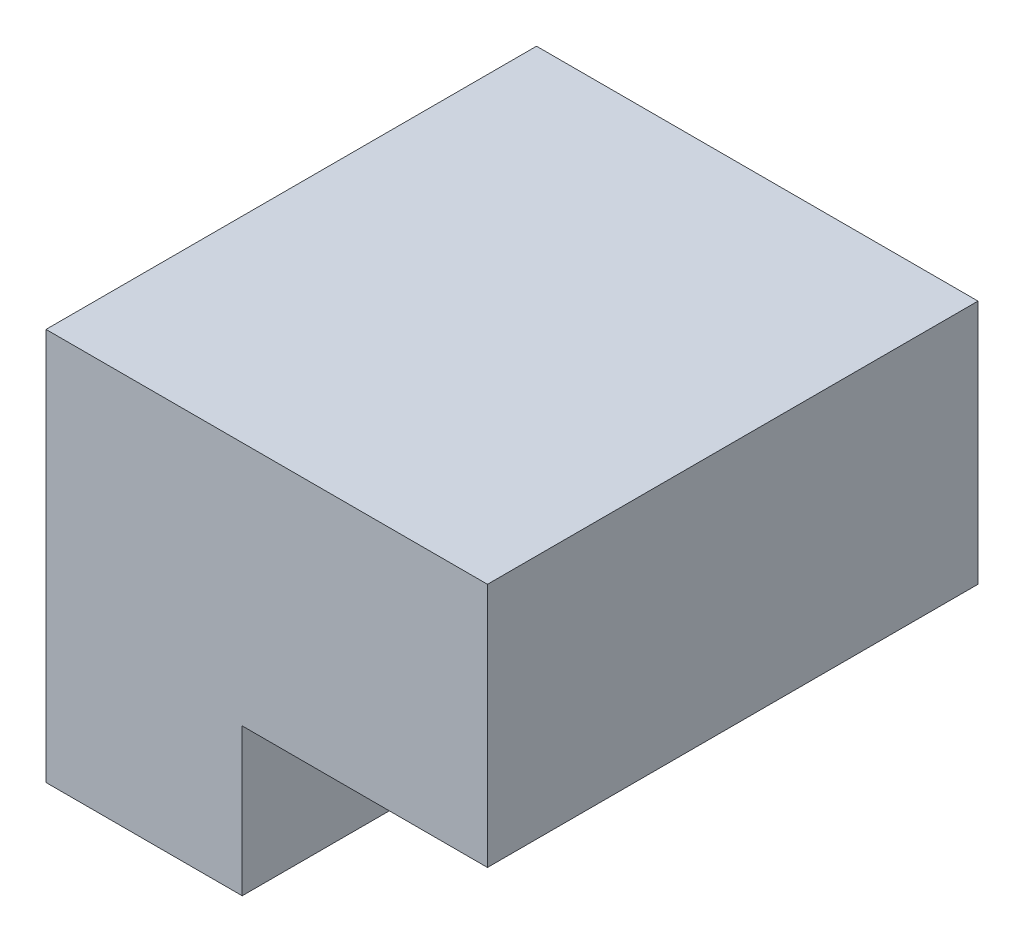
ISO-10303-21;
HEADER;
FILE_DESCRIPTION(('STEP AP214'),'2;1');
FILE_NAME('part.step','',(''),(''),'','','');
FILE_SCHEMA(('AUTOMOTIVE_DESIGN { 1 0 10303 214 1 1 1 1 }'));
ENDSEC;
DATA;
#1=APPLICATION_CONTEXT('core data for automotive mechanical design processes');
#2=APPLICATION_PROTOCOL_DEFINITION('international standard','automotive_design',2000,#1);
#3=PRODUCT_CONTEXT('',#1,'mechanical');
#4=PRODUCT('Part','Part','',(#3));
#5=PRODUCT_RELATED_PRODUCT_CATEGORY('part','',(#4));
#6=PRODUCT_DEFINITION_FORMATION('','',#4);
#7=PRODUCT_DEFINITION_CONTEXT('part definition',#1,'design');
#8=PRODUCT_DEFINITION('design','',#6,#7);
#9=PRODUCT_DEFINITION_SHAPE('','',#8);
#10=(LENGTH_UNIT() NAMED_UNIT(*) SI_UNIT(.MILLI.,.METRE.));
#11=(NAMED_UNIT(*) PLANE_ANGLE_UNIT() SI_UNIT($,.RADIAN.));
#12=(NAMED_UNIT(*) SI_UNIT($,.STERADIAN.) SOLID_ANGLE_UNIT());
#13=UNCERTAINTY_MEASURE_WITH_UNIT(LENGTH_MEASURE(1.E-05),#10,'distance_accuracy_value','');
#14=(GEOMETRIC_REPRESENTATION_CONTEXT(3) GLOBAL_UNCERTAINTY_ASSIGNED_CONTEXT((#13)) GLOBAL_UNIT_ASSIGNED_CONTEXT((#10,
#11,#12)) REPRESENTATION_CONTEXT('',''));
#15=CARTESIAN_POINT('',(0.,0.,0.));
#16=DIRECTION('',(0.,0.,1.));
#17=DIRECTION('',(1.,0.,0.));
#18=AXIS2_PLACEMENT_3D('',#15,#16,#17);
#19=CARTESIAN_POINT('',(4.,0.,10.));
#20=DIRECTION('',(0.,1.,0.));
#21=DIRECTION('',(-1.,0.,0.));
#22=AXIS2_PLACEMENT_3D('',#19,#20,#21);
#23=PLANE('',#22);
#24=DIRECTION('',(1.,0.,0.));
#25=VECTOR('',#24,1.);
#26=CARTESIAN_POINT('',(4.,0.,0.));
#27=LINE('',#26,#25);
#28=CARTESIAN_POINT('',(0.,0.,0.));
#29=VERTEX_POINT('',#28);
#30=CARTESIAN_POINT('',(4.,0.,0.));
#31=VERTEX_POINT('',#30);
#32=EDGE_CURVE('E115',#29,#31,#27,.T.);
#33=ORIENTED_EDGE('',*,*,#32,.T.);
#34=DIRECTION('',(0.,0.,-1.));
#35=VECTOR('',#34,1.);
#36=CARTESIAN_POINT('',(4.,0.,10.));
#37=LINE('',#36,#35);
#38=CARTESIAN_POINT('',(4.,0.,10.));
#39=VERTEX_POINT('',#38);
#40=EDGE_CURVE('E11',#39,#31,#37,.T.);
#41=ORIENTED_EDGE('',*,*,#40,.F.);
#42=DIRECTION('',(1.,0.,0.));
#43=VECTOR('',#42,1.);
#44=CARTESIAN_POINT('',(4.,0.,10.));
#45=LINE('',#44,#43);
#46=CARTESIAN_POINT('',(0.,0.,10.));
#47=VERTEX_POINT('',#46);
#48=EDGE_CURVE('E125',#47,#39,#45,.T.);
#49=ORIENTED_EDGE('',*,*,#48,.F.);
#50=DIRECTION('',(0.,0.,-1.));
#51=VECTOR('',#50,1.);
#52=CARTESIAN_POINT('',(0.,0.,10.));
#53=LINE('',#52,#51);
#54=EDGE_CURVE('E111',#47,#29,#53,.T.);
#55=ORIENTED_EDGE('',*,*,#54,.T.);
#56=EDGE_LOOP('',(#33,#41,#49,#55));
#57=FACE_BOUND('',#56,.T.);
#58=ADVANCED_FACE('F31',(#57),#23,.F.);
#59=CARTESIAN_POINT('',(4.,3.,10.));
#60=DIRECTION('',(-1.,0.,0.));
#61=DIRECTION('',(0.,0.,1.));
#62=AXIS2_PLACEMENT_3D('',#59,#60,#61);
#63=PLANE('',#62);
#64=DIRECTION('',(0.,1.,0.));
#65=VECTOR('',#64,1.);
#66=CARTESIAN_POINT('',(4.,3.,0.));
#67=LINE('',#66,#65);
#68=CARTESIAN_POINT('',(4.,3.,0.));
#69=VERTEX_POINT('',#68);
#70=EDGE_CURVE('E118',#31,#69,#67,.T.);
#71=ORIENTED_EDGE('',*,*,#70,.T.);
#72=DIRECTION('',(0.,0.,-1.));
#73=VECTOR('',#72,1.);
#74=CARTESIAN_POINT('',(4.,3.,10.));
#75=LINE('',#74,#73);
#76=CARTESIAN_POINT('',(4.,3.,10.));
#77=VERTEX_POINT('',#76);
#78=EDGE_CURVE('E39',#77,#69,#75,.T.);
#79=ORIENTED_EDGE('',*,*,#78,.F.);
#80=DIRECTION('',(0.,1.,0.));
#81=VECTOR('',#80,1.);
#82=CARTESIAN_POINT('',(4.,3.,10.));
#83=LINE('',#82,#81);
#84=EDGE_CURVE('E84',#39,#77,#83,.T.);
#85=ORIENTED_EDGE('',*,*,#84,.F.);
#86=ORIENTED_EDGE('',*,*,#40,.T.);
#87=EDGE_LOOP('',(#71,#79,#85,#86));
#88=FACE_BOUND('',#87,.T.);
#89=ADVANCED_FACE('F149',(#88),#63,.F.);
#90=CARTESIAN_POINT('',(9.,3.,10.));
#91=DIRECTION('',(0.,1.,0.));
#92=DIRECTION('',(-1.,0.,0.));
#93=AXIS2_PLACEMENT_3D('',#90,#91,#92);
#94=PLANE('',#93);
#95=DIRECTION('',(1.,0.,0.));
#96=VECTOR('',#95,1.);
#97=CARTESIAN_POINT('',(9.,3.,0.));
#98=LINE('',#97,#96);
#99=CARTESIAN_POINT('',(9.,3.,0.));
#100=VERTEX_POINT('',#99);
#101=EDGE_CURVE('E120',#69,#100,#98,.T.);
#102=ORIENTED_EDGE('',*,*,#101,.T.);
#103=DIRECTION('',(0.,0.,-1.));
#104=VECTOR('',#103,1.);
#105=CARTESIAN_POINT('',(9.,3.,10.));
#106=LINE('',#105,#104);
#107=CARTESIAN_POINT('',(9.,3.,10.));
#108=VERTEX_POINT('',#107);
#109=EDGE_CURVE('E106',#108,#100,#106,.T.);
#110=ORIENTED_EDGE('',*,*,#109,.F.);
#111=DIRECTION('',(1.,0.,0.));
#112=VECTOR('',#111,1.);
#113=CARTESIAN_POINT('',(9.,3.,10.));
#114=LINE('',#113,#112);
#115=EDGE_CURVE('E97',#77,#108,#114,.T.);
#116=ORIENTED_EDGE('',*,*,#115,.F.);
#117=ORIENTED_EDGE('',*,*,#78,.T.);
#118=EDGE_LOOP('',(#102,#110,#116,#117));
#119=FACE_BOUND('',#118,.T.);
#120=ADVANCED_FACE('F131',(#119),#94,.F.);
#121=CARTESIAN_POINT('',(9.,8.,10.));
#122=DIRECTION('',(-1.,0.,0.));
#123=DIRECTION('',(0.,0.,1.));
#124=AXIS2_PLACEMENT_3D('',#121,#122,#123);
#125=PLANE('',#124);
#126=DIRECTION('',(0.,1.,0.));
#127=VECTOR('',#126,1.);
#128=CARTESIAN_POINT('',(9.,8.,0.));
#129=LINE('',#128,#127);
#130=CARTESIAN_POINT('',(9.,8.,0.));
#131=VERTEX_POINT('',#130);
#132=EDGE_CURVE('E105',#100,#131,#129,.T.);
#133=ORIENTED_EDGE('',*,*,#132,.T.);
#134=DIRECTION('',(0.,0.,-1.));
#135=VECTOR('',#134,1.);
#136=CARTESIAN_POINT('',(9.,8.,10.));
#137=LINE('',#136,#135);
#138=CARTESIAN_POINT('',(9.,8.,10.));
#139=VERTEX_POINT('',#138);
#140=EDGE_CURVE('E102',#139,#131,#137,.T.);
#141=ORIENTED_EDGE('',*,*,#140,.F.);
#142=DIRECTION('',(0.,1.,0.));
#143=VECTOR('',#142,1.);
#144=CARTESIAN_POINT('',(9.,8.,10.));
#145=LINE('',#144,#143);
#146=EDGE_CURVE('E91',#108,#139,#145,.T.);
#147=ORIENTED_EDGE('',*,*,#146,.F.);
#148=ORIENTED_EDGE('',*,*,#109,.T.);
#149=EDGE_LOOP('',(#133,#141,#147,#148));
#150=FACE_BOUND('',#149,.T.);
#151=ADVANCED_FACE('F103',(#150),#125,.F.);
#152=CARTESIAN_POINT('',(0.,8.,10.));
#153=DIRECTION('',(0.,-1.,0.));
#154=DIRECTION('',(0.,0.,-1.));
#155=AXIS2_PLACEMENT_3D('',#152,#153,#154);
#156=PLANE('',#155);
#157=DIRECTION('',(-1.,0.,0.));
#158=VECTOR('',#157,1.);
#159=CARTESIAN_POINT('',(0.,8.,0.));
#160=LINE('',#159,#158);
#161=CARTESIAN_POINT('',(0.,8.,0.));
#162=VERTEX_POINT('',#161);
#163=EDGE_CURVE('E70',#131,#162,#160,.T.);
#164=ORIENTED_EDGE('',*,*,#163,.T.);
#165=DIRECTION('',(0.,0.,-1.));
#166=VECTOR('',#165,1.);
#167=CARTESIAN_POINT('',(0.,8.,10.));
#168=LINE('',#167,#166);
#169=CARTESIAN_POINT('',(0.,8.,10.));
#170=VERTEX_POINT('',#169);
#171=EDGE_CURVE('E107',#170,#162,#168,.T.);
#172=ORIENTED_EDGE('',*,*,#171,.F.);
#173=DIRECTION('',(-1.,0.,0.));
#174=VECTOR('',#173,1.);
#175=CARTESIAN_POINT('',(0.,8.,10.));
#176=LINE('',#175,#174);
#177=EDGE_CURVE('E95',#139,#170,#176,.T.);
#178=ORIENTED_EDGE('',*,*,#177,.F.);
#179=ORIENTED_EDGE('',*,*,#140,.T.);
#180=EDGE_LOOP('',(#164,#172,#178,#179));
#181=FACE_BOUND('',#180,.T.);
#182=ADVANCED_FACE('F109',(#181),#156,.F.);
#183=CARTESIAN_POINT('',(0.,0.,10.));
#184=DIRECTION('',(1.,0.,0.));
#185=DIRECTION('',(0.,0.,-1.));
#186=AXIS2_PLACEMENT_3D('',#183,#184,#185);
#187=PLANE('',#186);
#188=DIRECTION('',(0.,-1.,0.));
#189=VECTOR('',#188,1.);
#190=CARTESIAN_POINT('',(0.,0.,0.));
#191=LINE('',#190,#189);
#192=EDGE_CURVE('E76',#162,#29,#191,.T.);
#193=ORIENTED_EDGE('',*,*,#192,.T.);
#194=ORIENTED_EDGE('',*,*,#54,.F.);
#195=DIRECTION('',(0.,-1.,0.));
#196=VECTOR('',#195,1.);
#197=CARTESIAN_POINT('',(0.,0.,10.));
#198=LINE('',#197,#196);
#199=EDGE_CURVE('E47',#170,#47,#198,.T.);
#200=ORIENTED_EDGE('',*,*,#199,.F.);
#201=ORIENTED_EDGE('',*,*,#171,.T.);
#202=EDGE_LOOP('',(#193,#194,#200,#201));
#203=FACE_BOUND('',#202,.T.);
#204=ADVANCED_FACE('F138',(#203),#187,.F.);
#205=CARTESIAN_POINT('',(0.,0.,10.));
#206=DIRECTION('',(0.,0.,-1.));
#207=DIRECTION('',(-1.,0.,0.));
#208=AXIS2_PLACEMENT_3D('',#205,#206,#207);
#209=PLANE('',#208);
#210=ORIENTED_EDGE('',*,*,#48,.T.);
#211=ORIENTED_EDGE('',*,*,#84,.T.);
#212=ORIENTED_EDGE('',*,*,#115,.T.);
#213=ORIENTED_EDGE('',*,*,#146,.T.);
#214=ORIENTED_EDGE('',*,*,#177,.T.);
#215=ORIENTED_EDGE('',*,*,#199,.T.);
#216=EDGE_LOOP('',(#210,#211,#212,#213,#214,#215));
#217=FACE_BOUND('',#216,.T.);
#218=ADVANCED_FACE('F93',(#217),#209,.F.);
#219=CARTESIAN_POINT('',(0.,0.,0.));
#220=DIRECTION('',(0.,0.,-1.));
#221=DIRECTION('',(-1.,0.,0.));
#222=AXIS2_PLACEMENT_3D('',#219,#220,#221);
#223=PLANE('',#222);
#224=ORIENTED_EDGE('',*,*,#32,.F.);
#225=ORIENTED_EDGE('',*,*,#192,.F.);
#226=ORIENTED_EDGE('',*,*,#163,.F.);
#227=ORIENTED_EDGE('',*,*,#132,.F.);
#228=ORIENTED_EDGE('',*,*,#101,.F.);
#229=ORIENTED_EDGE('',*,*,#70,.F.);
#230=EDGE_LOOP('',(#224,#225,#226,#227,#228,#229));
#231=FACE_BOUND('',#230,.T.);
#232=ADVANCED_FACE('F134',(#231),#223,.T.);
#233=CLOSED_SHELL('',(#58,#89,#120,#151,#182,#204,#218,#232));
#234=MANIFOLD_SOLID_BREP('B2',#233);
#235=ADVANCED_BREP_SHAPE_REPRESENTATION('',(#18,#234),#14);
#236=SHAPE_DEFINITION_REPRESENTATION(#9,#235);
ENDSEC;
END-ISO-10303-21;
